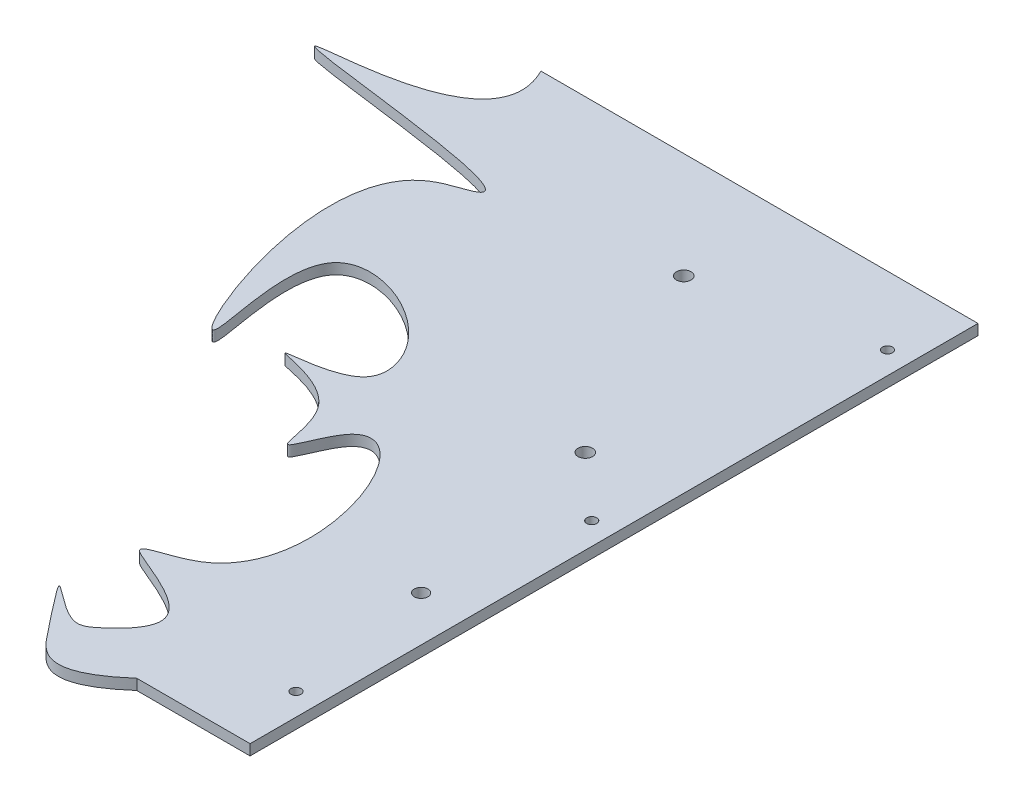
ISO-10303-21;
HEADER;
FILE_DESCRIPTION(('STEP AP214'),'2;1');
FILE_NAME('part.step','',(''),(''),'','','');
FILE_SCHEMA(('AUTOMOTIVE_DESIGN { 1 0 10303 214 1 1 1 1 }'));
ENDSEC;
DATA;
#1=APPLICATION_CONTEXT('core data for automotive mechanical design processes');
#2=APPLICATION_PROTOCOL_DEFINITION('international standard','automotive_design',2000,#1);
#3=PRODUCT_CONTEXT('',#1,'mechanical');
#4=PRODUCT('Part','Part','',(#3));
#5=PRODUCT_RELATED_PRODUCT_CATEGORY('part','',(#4));
#6=PRODUCT_DEFINITION_FORMATION('','',#4);
#7=PRODUCT_DEFINITION_CONTEXT('part definition',#1,'design');
#8=PRODUCT_DEFINITION('design','',#6,#7);
#9=PRODUCT_DEFINITION_SHAPE('','',#8);
#10=(LENGTH_UNIT() NAMED_UNIT(*) SI_UNIT(.MILLI.,.METRE.));
#11=(NAMED_UNIT(*) PLANE_ANGLE_UNIT() SI_UNIT($,.RADIAN.));
#12=(NAMED_UNIT(*) SI_UNIT($,.STERADIAN.) SOLID_ANGLE_UNIT());
#13=UNCERTAINTY_MEASURE_WITH_UNIT(LENGTH_MEASURE(1.E-05),#10,'distance_accuracy_value','');
#14=(GEOMETRIC_REPRESENTATION_CONTEXT(3) GLOBAL_UNCERTAINTY_ASSIGNED_CONTEXT((#13)) GLOBAL_UNIT_ASSIGNED_CONTEXT((#10,
#11,#12)) REPRESENTATION_CONTEXT('',''));
#15=CARTESIAN_POINT('',(0.,0.,0.));
#16=DIRECTION('',(0.,0.,1.));
#17=DIRECTION('',(1.,0.,0.));
#18=AXIS2_PLACEMENT_3D('',#15,#16,#17);
#19=CARTESIAN_POINT('',(0.,2.9718,-203.2));
#20=DIRECTION('',(0.,0.,-1.));
#21=DIRECTION('',(-1.,0.,0.));
#22=AXIS2_PLACEMENT_3D('',#19,#20,#21);
#23=PLANE('',#22);
#24=DIRECTION('',(0.,1.,0.));
#25=VECTOR('',#24,1.);
#26=CARTESIAN_POINT('',(31.6309191849911,0.,-203.2));
#27=LINE('',#26,#25);
#28=CARTESIAN_POINT('',(31.6309191849911,0.,-203.2));
#29=VERTEX_POINT('',#28);
#30=CARTESIAN_POINT('',(31.6309191849911,2.9718,-203.2));
#31=VERTEX_POINT('',#30);
#32=EDGE_CURVE('E139',#29,#31,#27,.T.);
#33=ORIENTED_EDGE('',*,*,#32,.F.);
#34=DIRECTION('',(1.,0.,0.));
#35=VECTOR('',#34,1.);
#36=CARTESIAN_POINT('',(0.,0.,-203.2));
#37=LINE('',#36,#35);
#38=CARTESIAN_POINT('',(-90.3859000000005,0.,-203.2));
#39=VERTEX_POINT('',#38);
#40=EDGE_CURVE('E85',#39,#29,#37,.T.);
#41=ORIENTED_EDGE('',*,*,#40,.F.);
#42=DIRECTION('',(0.,-1.,0.));
#43=VECTOR('',#42,1.);
#44=CARTESIAN_POINT('',(-90.3859000000005,2.9718,-203.2));
#45=LINE('',#44,#43);
#46=CARTESIAN_POINT('',(-90.3859000000005,2.9718,-203.2));
#47=VERTEX_POINT('',#46);
#48=EDGE_CURVE('E11',#47,#39,#45,.T.);
#49=ORIENTED_EDGE('',*,*,#48,.F.);
#50=DIRECTION('',(1.,0.,0.));
#51=VECTOR('',#50,1.);
#52=CARTESIAN_POINT('',(0.,2.9718,-203.2));
#53=LINE('',#52,#51);
#54=EDGE_CURVE('E84',#47,#31,#53,.T.);
#55=ORIENTED_EDGE('',*,*,#54,.T.);
#56=EDGE_LOOP('',(#33,#41,#49,#55));
#57=FACE_BOUND('',#56,.T.);
#58=ADVANCED_FACE('F35',(#57),#23,.T.);
#59=CARTESIAN_POINT('',(0.,2.9718,0.));
#60=DIRECTION('',(0.,0.,-1.));
#61=DIRECTION('',(-1.,0.,0.));
#62=AXIS2_PLACEMENT_3D('',#59,#60,#61);
#63=PLANE('',#62);
#64=DIRECTION('',(1.,0.,0.));
#65=VECTOR('',#64,1.);
#66=CARTESIAN_POINT('',(0.,0.,0.));
#67=LINE('',#66,#65);
#68=CARTESIAN_POINT('',(0.,0.,0.));
#69=VERTEX_POINT('',#68);
#70=CARTESIAN_POINT('',(31.6309191849911,0.,0.));
#71=VERTEX_POINT('',#70);
#72=EDGE_CURVE('E117',#69,#71,#67,.T.);
#73=ORIENTED_EDGE('',*,*,#72,.T.);
#74=DIRECTION('',(0.,1.,0.));
#75=VECTOR('',#74,1.);
#76=CARTESIAN_POINT('',(31.6309191849911,0.,0.));
#77=LINE('',#76,#75);
#78=CARTESIAN_POINT('',(31.6309191849911,2.9718,0.));
#79=VERTEX_POINT('',#78);
#80=EDGE_CURVE('E50',#71,#79,#77,.T.);
#81=ORIENTED_EDGE('',*,*,#80,.T.);
#82=DIRECTION('',(1.,0.,0.));
#83=VECTOR('',#82,1.);
#84=CARTESIAN_POINT('',(0.,2.9718,0.));
#85=LINE('',#84,#83);
#86=CARTESIAN_POINT('',(0.,2.9718,0.));
#87=VERTEX_POINT('',#86);
#88=EDGE_CURVE('E90',#87,#79,#85,.T.);
#89=ORIENTED_EDGE('',*,*,#88,.F.);
#90=DIRECTION('',(0.,-1.,0.));
#91=VECTOR('',#90,1.);
#92=CARTESIAN_POINT('',(0.,2.9718,0.));
#93=LINE('',#92,#91);
#94=EDGE_CURVE('E43',#87,#69,#93,.T.);
#95=ORIENTED_EDGE('',*,*,#94,.T.);
#96=EDGE_LOOP('',(#73,#81,#89,#95));
#97=FACE_BOUND('',#96,.T.);
#98=ADVANCED_FACE('F134',(#97),#63,.F.);
#99=CARTESIAN_POINT('',(25.4,2.9718,-19.05));
#100=DIRECTION('',(0.,-1.,0.));
#101=DIRECTION('',(0.,0.,-1.));
#102=AXIS2_PLACEMENT_3D('',#99,#100,#101);
#103=CYLINDRICAL_SURFACE('',#102,1.397);
#104=CARTESIAN_POINT('',(25.4,2.9718,-19.05));
#105=DIRECTION('',(0.,1.,0.));
#106=DIRECTION('',(0.,0.,1.));
#107=AXIS2_PLACEMENT_3D('',#104,#105,#106);
#108=CIRCLE('',#107,1.397);
#109=CARTESIAN_POINT('',(25.4,2.9718,-17.653));
#110=VERTEX_POINT('',#109);
#111=EDGE_CURVE('E107',#110,#110,#108,.T.);
#112=ORIENTED_EDGE('',*,*,#111,.T.);
#113=EDGE_LOOP('',(#112));
#114=FACE_BOUND('',#113,.T.);
#115=CARTESIAN_POINT('',(25.4,0.,-19.05));
#116=DIRECTION('',(0.,1.,0.));
#117=DIRECTION('',(0.,0.,1.));
#118=AXIS2_PLACEMENT_3D('',#115,#116,#117);
#119=CIRCLE('',#118,1.397);
#120=CARTESIAN_POINT('',(25.4,0.,-17.653));
#121=VERTEX_POINT('',#120);
#122=EDGE_CURVE('E129',#121,#121,#119,.T.);
#123=ORIENTED_EDGE('',*,*,#122,.F.);
#124=EDGE_LOOP('',(#123));
#125=FACE_BOUND('',#124,.T.);
#126=ADVANCED_FACE('F166',(#114,#125),#103,.F.);
#127=CARTESIAN_POINT('',(25.3999999999997,2.9718,-101.6));
#128=DIRECTION('',(0.,-1.,0.));
#129=DIRECTION('',(0.,0.,-1.));
#130=AXIS2_PLACEMENT_3D('',#127,#128,#129);
#131=CYLINDRICAL_SURFACE('',#130,1.397);
#132=CARTESIAN_POINT('',(25.3999999999997,2.9718,-101.6));
#133=DIRECTION('',(0.,1.,0.));
#134=DIRECTION('',(0.,0.,1.));
#135=AXIS2_PLACEMENT_3D('',#132,#133,#134);
#136=CIRCLE('',#135,1.397);
#137=CARTESIAN_POINT('',(25.3999999999997,2.9718,-100.203));
#138=VERTEX_POINT('',#137);
#139=EDGE_CURVE('E104',#138,#138,#136,.T.);
#140=ORIENTED_EDGE('',*,*,#139,.T.);
#141=EDGE_LOOP('',(#140));
#142=FACE_BOUND('',#141,.T.);
#143=CARTESIAN_POINT('',(25.3999999999997,0.,-101.6));
#144=DIRECTION('',(0.,1.,0.));
#145=DIRECTION('',(0.,0.,1.));
#146=AXIS2_PLACEMENT_3D('',#143,#144,#145);
#147=CIRCLE('',#146,1.397);
#148=CARTESIAN_POINT('',(25.3999999999997,0.,-100.203));
#149=VERTEX_POINT('',#148);
#150=EDGE_CURVE('E126',#149,#149,#147,.T.);
#151=ORIENTED_EDGE('',*,*,#150,.F.);
#152=EDGE_LOOP('',(#151));
#153=FACE_BOUND('',#152,.T.);
#154=ADVANCED_FACE('F169',(#142,#153),#131,.F.);
#155=CARTESIAN_POINT('',(25.3999999999994,2.9718,-184.15));
#156=DIRECTION('',(0.,-1.,0.));
#157=DIRECTION('',(0.,0.,-1.));
#158=AXIS2_PLACEMENT_3D('',#155,#156,#157);
#159=CYLINDRICAL_SURFACE('',#158,1.397);
#160=CARTESIAN_POINT('',(25.3999999999994,2.9718,-184.15));
#161=DIRECTION('',(0.,1.,0.));
#162=DIRECTION('',(0.,0.,1.));
#163=AXIS2_PLACEMENT_3D('',#160,#161,#162);
#164=CIRCLE('',#163,1.397);
#165=CARTESIAN_POINT('',(25.3999999999994,2.9718,-182.753));
#166=VERTEX_POINT('',#165);
#167=EDGE_CURVE('E101',#166,#166,#164,.T.);
#168=ORIENTED_EDGE('',*,*,#167,.T.);
#169=EDGE_LOOP('',(#168));
#170=FACE_BOUND('',#169,.T.);
#171=CARTESIAN_POINT('',(25.3999999999994,0.,-184.15));
#172=DIRECTION('',(0.,1.,0.));
#173=DIRECTION('',(0.,0.,1.));
#174=AXIS2_PLACEMENT_3D('',#171,#172,#173);
#175=CIRCLE('',#174,1.397);
#176=CARTESIAN_POINT('',(25.3999999999994,0.,-182.753));
#177=VERTEX_POINT('',#176);
#178=EDGE_CURVE('E123',#177,#177,#175,.T.);
#179=ORIENTED_EDGE('',*,*,#178,.F.);
#180=EDGE_LOOP('',(#179));
#181=FACE_BOUND('',#180,.T.);
#182=ADVANCED_FACE('F173',(#170,#181),#159,.F.);
#183=CARTESIAN_POINT('',(8.00192669314725,2.9718,-117.195820473059));
#184=DIRECTION('',(0.,-1.,0.));
#185=DIRECTION('',(0.,0.,-1.));
#186=AXIS2_PLACEMENT_3D('',#183,#184,#185);
#187=CYLINDRICAL_SURFACE('',#186,2.032);
#188=CARTESIAN_POINT('',(8.00192669314725,2.9718,-117.195820473059));
#189=DIRECTION('',(0.,1.,0.));
#190=DIRECTION('',(0.,0.,1.));
#191=AXIS2_PLACEMENT_3D('',#188,#189,#190);
#192=CIRCLE('',#191,2.032);
#193=CARTESIAN_POINT('',(8.00192669314725,2.9718,-115.163820473059));
#194=VERTEX_POINT('',#193);
#195=EDGE_CURVE('E93',#194,#194,#192,.T.);
#196=ORIENTED_EDGE('',*,*,#195,.T.);
#197=EDGE_LOOP('',(#196));
#198=FACE_BOUND('',#197,.T.);
#199=CARTESIAN_POINT('',(8.00192669314725,0.,-117.195820473059));
#200=DIRECTION('',(0.,1.,0.));
#201=DIRECTION('',(0.,0.,1.));
#202=AXIS2_PLACEMENT_3D('',#199,#200,#201);
#203=CIRCLE('',#202,2.032);
#204=CARTESIAN_POINT('',(8.00192669314725,0.,-115.163820473059));
#205=VERTEX_POINT('',#204);
#206=EDGE_CURVE('E120',#205,#205,#203,.T.);
#207=ORIENTED_EDGE('',*,*,#206,.F.);
#208=EDGE_LOOP('',(#207));
#209=FACE_BOUND('',#208,.T.);
#210=ADVANCED_FACE('F177',(#198,#209),#187,.F.);
#211=CARTESIAN_POINT('',(-20.9228833804103,2.9718,-173.612500152905));
#212=DIRECTION('',(0.,-1.,0.));
#213=DIRECTION('',(0.,0.,-1.));
#214=AXIS2_PLACEMENT_3D('',#211,#212,#213);
#215=CYLINDRICAL_SURFACE('',#214,2.032);
#216=CARTESIAN_POINT('',(-20.9228833804103,2.9718,-173.612500152905));
#217=DIRECTION('',(0.,1.,0.));
#218=DIRECTION('',(0.,0.,1.));
#219=AXIS2_PLACEMENT_3D('',#216,#217,#218);
#220=CIRCLE('',#219,2.032);
#221=CARTESIAN_POINT('',(-20.9228833804103,2.9718,-171.580500152905));
#222=VERTEX_POINT('',#221);
#223=EDGE_CURVE('E91',#222,#222,#220,.T.);
#224=ORIENTED_EDGE('',*,*,#223,.T.);
#225=EDGE_LOOP('',(#224));
#226=FACE_BOUND('',#225,.T.);
#227=CARTESIAN_POINT('',(-20.9228833804103,0.,-173.612500152905));
#228=DIRECTION('',(0.,1.,0.));
#229=DIRECTION('',(0.,0.,1.));
#230=AXIS2_PLACEMENT_3D('',#227,#228,#229);
#231=CIRCLE('',#230,2.032);
#232=CARTESIAN_POINT('',(-20.9228833804103,0.,-171.580500152905));
#233=VERTEX_POINT('',#232);
#234=EDGE_CURVE('E113',#233,#233,#231,.T.);
#235=ORIENTED_EDGE('',*,*,#234,.F.);
#236=EDGE_LOOP('',(#235));
#237=FACE_BOUND('',#236,.T.);
#238=ADVANCED_FACE('F37',(#226,#237),#215,.F.);
#239=CARTESIAN_POINT('',(19.05,2.9718,-60.325));
#240=DIRECTION('',(0.,-1.,0.));
#241=DIRECTION('',(0.,0.,-1.));
#242=AXIS2_PLACEMENT_3D('',#239,#240,#241);
#243=CYLINDRICAL_SURFACE('',#242,1.905);
#244=CARTESIAN_POINT('',(19.05,2.9718,-60.325));
#245=DIRECTION('',(0.,1.,0.));
#246=DIRECTION('',(0.,0.,1.));
#247=AXIS2_PLACEMENT_3D('',#244,#245,#246);
#248=CIRCLE('',#247,1.905);
#249=CARTESIAN_POINT('',(19.05,2.9718,-58.42));
#250=VERTEX_POINT('',#249);
#251=EDGE_CURVE('E110',#250,#250,#248,.T.);
#252=ORIENTED_EDGE('',*,*,#251,.T.);
#253=EDGE_LOOP('',(#252));
#254=FACE_BOUND('',#253,.T.);
#255=CARTESIAN_POINT('',(19.05,0.,-60.325));
#256=DIRECTION('',(0.,1.,0.));
#257=DIRECTION('',(0.,0.,1.));
#258=AXIS2_PLACEMENT_3D('',#255,#256,#257);
#259=CIRCLE('',#258,1.905);
#260=CARTESIAN_POINT('',(19.05,0.,-58.42));
#261=VERTEX_POINT('',#260);
#262=EDGE_CURVE('E96',#261,#261,#259,.T.);
#263=ORIENTED_EDGE('',*,*,#262,.F.);
#264=EDGE_LOOP('',(#263));
#265=FACE_BOUND('',#264,.T.);
#266=ADVANCED_FACE('F160',(#254,#265),#243,.F.);
#267=CARTESIAN_POINT('',(0.,2.9718,0.));
#268=DIRECTION('',(0.,1.,0.));
#269=DIRECTION('',(0.,0.,1.));
#270=AXIS2_PLACEMENT_3D('',#267,#268,#269);
#271=PLANE('',#270);
#272=DIRECTION('',(0.,0.,1.));
#273=VECTOR('',#272,1.);
#274=CARTESIAN_POINT('',(31.6309191849911,2.9718,0.));
#275=LINE('',#274,#273);
#276=EDGE_CURVE('E89',#31,#79,#275,.T.);
#277=ORIENTED_EDGE('',*,*,#276,.F.);
#278=ORIENTED_EDGE('',*,*,#54,.F.);
#279=CARTESIAN_POINT('',(0.,2.9718,0.));
#280=CARTESIAN_POINT('',(-14.4645948878299,2.9718,12.6956898284185));
#281=CARTESIAN_POINT('',(-45.3662352753858,2.9718,-26.0149358825167));
#282=CARTESIAN_POINT('',(-25.2914242086367,2.9718,-1.79030749192196));
#283=CARTESIAN_POINT('',(-15.7443809636019,2.9718,-7.80742889826676));
#284=CARTESIAN_POINT('',(-4.36114916184309,2.9718,-20.2164186583361));
#285=CARTESIAN_POINT('',(-20.9256850402866,2.9718,-26.8984787874602));
#286=CARTESIAN_POINT('',(-34.3906840580299,2.9718,-32.6052104494243));
#287=CARTESIAN_POINT('',(7.67518828404337,2.9718,-37.8722380776448));
#288=CARTESIAN_POINT('',(-23.3746144077905,2.9718,-114.697788395826));
#289=CARTESIAN_POINT('',(-36.7041735862336,2.9718,-69.8936075484726));
#290=CARTESIAN_POINT('',(-36.131542501149,2.9718,-97.5495030693918));
#291=CARTESIAN_POINT('',(-70.641711547488,2.9718,-99.5005560397129));
#292=CARTESIAN_POINT('',(-37.8552966113017,2.9718,-100.496777307158));
#293=CARTESIAN_POINT('',(-40.756498409597,2.9718,-124.838600148654));
#294=CARTESIAN_POINT('',(-85.4307653132301,2.9718,-143.187597424625));
#295=CARTESIAN_POINT('',(-60.9509952661789,2.9718,-57.6519585797915));
#296=CARTESIAN_POINT('',(-103.823887761536,2.9718,-156.563665875977));
#297=CARTESIAN_POINT('',(-47.6308913017507,2.9718,-169.647448316024));
#298=CARTESIAN_POINT('',(-186.570491630882,2.9718,-180.236051464975));
#299=CARTESIAN_POINT('',(-78.0053209619593,2.9718,-178.49195217076));
#300=CARTESIAN_POINT('',(-90.3859000000005,2.9718,-203.2));
#301=B_SPLINE_CURVE_WITH_KNOTS('',3,(#279,#280,#281,#282,#283,#284,#285,#286,#287,#288,#289,
#290,#291,#292,#293,#294,#295,#296,#297,#298,#299,#300),.UNSPECIFIED.,.F.,.F.,(4,1,1,1,1,1,1,1,
1,1,1,1,1,1,1,1,1,1,1,4),(0.,0.00721768259038966,0.0453298415374228,0.0547642616769481,
0.083217198200722,0.130285385821185,0.137597353400816,0.165212972469126,0.280552441046618,
0.307038367357562,0.338456759970852,0.381582262085761,0.421093035047996,0.443121968624883,
0.520121141294352,0.590944265091252,0.735519102059461,0.757642294239479,0.887962505632473,1.),.UNSPECIFIED.);
#302=EDGE_CURVE('E70',#87,#47,#301,.T.);
#303=ORIENTED_EDGE('',*,*,#302,.F.);
#304=ORIENTED_EDGE('',*,*,#88,.T.);
#305=EDGE_LOOP('',(#277,#278,#303,#304));
#306=FACE_BOUND('',#305,.T.);
#307=ORIENTED_EDGE('',*,*,#223,.F.);
#308=EDGE_LOOP('',(#307));
#309=FACE_BOUND('',#308,.T.);
#310=ORIENTED_EDGE('',*,*,#195,.F.);
#311=EDGE_LOOP('',(#310));
#312=FACE_BOUND('',#311,.T.);
#313=ORIENTED_EDGE('',*,*,#167,.F.);
#314=EDGE_LOOP('',(#313));
#315=FACE_BOUND('',#314,.T.);
#316=ORIENTED_EDGE('',*,*,#139,.F.);
#317=EDGE_LOOP('',(#316));
#318=FACE_BOUND('',#317,.T.);
#319=ORIENTED_EDGE('',*,*,#111,.F.);
#320=EDGE_LOOP('',(#319));
#321=FACE_BOUND('',#320,.T.);
#322=ORIENTED_EDGE('',*,*,#251,.F.);
#323=EDGE_LOOP('',(#322));
#324=FACE_BOUND('',#323,.T.);
#325=ADVANCED_FACE('F87',(#306,#309,#312,#315,#318,#321,#324),#271,.T.);
#326=CARTESIAN_POINT('',(0.,0.,0.));
#327=DIRECTION('',(0.,1.,0.));
#328=DIRECTION('',(0.,0.,1.));
#329=AXIS2_PLACEMENT_3D('',#326,#327,#328);
#330=PLANE('',#329);
#331=ORIENTED_EDGE('',*,*,#40,.T.);
#332=DIRECTION('',(0.,0.,1.));
#333=VECTOR('',#332,1.);
#334=CARTESIAN_POINT('',(31.6309191849911,0.,0.));
#335=LINE('',#334,#333);
#336=EDGE_CURVE('E137',#29,#71,#335,.T.);
#337=ORIENTED_EDGE('',*,*,#336,.T.);
#338=ORIENTED_EDGE('',*,*,#72,.F.);
#339=CARTESIAN_POINT('',(0.,0.,0.));
#340=CARTESIAN_POINT('',(-14.4645948878299,0.,12.6956898284185));
#341=CARTESIAN_POINT('',(-45.3662352753858,0.,-26.0149358825167));
#342=CARTESIAN_POINT('',(-25.2914242086367,0.,-1.79030749192196));
#343=CARTESIAN_POINT('',(-15.7443809636019,0.,-7.80742889826676));
#344=CARTESIAN_POINT('',(-4.36114916184309,0.,-20.2164186583361));
#345=CARTESIAN_POINT('',(-20.9256850402866,0.,-26.8984787874602));
#346=CARTESIAN_POINT('',(-34.3906840580299,0.,-32.6052104494243));
#347=CARTESIAN_POINT('',(7.67518828404337,0.,-37.8722380776448));
#348=CARTESIAN_POINT('',(-23.3746144077905,0.,-114.697788395826));
#349=CARTESIAN_POINT('',(-36.7041735862336,0.,-69.8936075484726));
#350=CARTESIAN_POINT('',(-36.131542501149,0.,-97.5495030693918));
#351=CARTESIAN_POINT('',(-70.641711547488,0.,-99.5005560397129));
#352=CARTESIAN_POINT('',(-37.8552966113017,0.,-100.496777307158));
#353=CARTESIAN_POINT('',(-40.756498409597,0.,-124.838600148654));
#354=CARTESIAN_POINT('',(-85.4307653132301,0.,-143.187597424625));
#355=CARTESIAN_POINT('',(-60.9509952661789,0.,-57.6519585797915));
#356=CARTESIAN_POINT('',(-103.823887761536,0.,-156.563665875977));
#357=CARTESIAN_POINT('',(-47.6308913017507,0.,-169.647448316024));
#358=CARTESIAN_POINT('',(-186.570491630882,0.,-180.236051464975));
#359=CARTESIAN_POINT('',(-78.0053209619593,0.,-178.49195217076));
#360=CARTESIAN_POINT('',(-90.3859000000005,0.,-203.2));
#361=B_SPLINE_CURVE_WITH_KNOTS('',3,(#339,#340,#341,#342,#343,#344,#345,#346,#347,#348,#349,
#350,#351,#352,#353,#354,#355,#356,#357,#358,#359,#360),.UNSPECIFIED.,.F.,.F.,(4,1,1,1,1,1,1,1,
1,1,1,1,1,1,1,1,1,1,1,4),(0.,0.00721768259038966,0.0453298415374228,0.0547642616769481,
0.083217198200722,0.130285385821185,0.137597353400816,0.165212972469126,0.280552441046618,
0.307038367357562,0.338456759970852,0.381582262085761,0.421093035047996,0.443121968624883,
0.520121141294352,0.590944265091252,0.735519102059461,0.757642294239479,0.887962505632473,1.),.UNSPECIFIED.);
#362=EDGE_CURVE('E59',#69,#39,#361,.T.);
#363=ORIENTED_EDGE('',*,*,#362,.T.);
#364=EDGE_LOOP('',(#331,#337,#338,#363));
#365=FACE_BOUND('',#364,.T.);
#366=ORIENTED_EDGE('',*,*,#234,.T.);
#367=EDGE_LOOP('',(#366));
#368=FACE_BOUND('',#367,.T.);
#369=ORIENTED_EDGE('',*,*,#206,.T.);
#370=EDGE_LOOP('',(#369));
#371=FACE_BOUND('',#370,.T.);
#372=ORIENTED_EDGE('',*,*,#178,.T.);
#373=EDGE_LOOP('',(#372));
#374=FACE_BOUND('',#373,.T.);
#375=ORIENTED_EDGE('',*,*,#150,.T.);
#376=EDGE_LOOP('',(#375));
#377=FACE_BOUND('',#376,.T.);
#378=ORIENTED_EDGE('',*,*,#122,.T.);
#379=EDGE_LOOP('',(#378));
#380=FACE_BOUND('',#379,.T.);
#381=ORIENTED_EDGE('',*,*,#262,.T.);
#382=EDGE_LOOP('',(#381));
#383=FACE_BOUND('',#382,.T.);
#384=ADVANCED_FACE('F135',(#365,#368,#371,#374,#377,#380,#383),#330,.F.);
#385=DIRECTION('',(0.,1.,0.));
#386=VECTOR('',#385,1.);
#387=SURFACE_OF_LINEAR_EXTRUSION('',#361,#386);
#388=ORIENTED_EDGE('',*,*,#302,.T.);
#389=ORIENTED_EDGE('',*,*,#48,.T.);
#390=ORIENTED_EDGE('',*,*,#362,.F.);
#391=ORIENTED_EDGE('',*,*,#94,.F.);
#392=EDGE_LOOP('',(#388,#389,#390,#391));
#393=FACE_BOUND('',#392,.T.);
#394=ADVANCED_FACE('F72',(#393),#387,.F.);
#395=CARTESIAN_POINT('',(31.6309191849911,0.,0.));
#396=DIRECTION('',(-1.,0.,0.));
#397=DIRECTION('',(0.,0.,1.));
#398=AXIS2_PLACEMENT_3D('',#395,#396,#397);
#399=PLANE('',#398);
#400=ORIENTED_EDGE('',*,*,#276,.T.);
#401=ORIENTED_EDGE('',*,*,#80,.F.);
#402=ORIENTED_EDGE('',*,*,#336,.F.);
#403=ORIENTED_EDGE('',*,*,#32,.T.);
#404=EDGE_LOOP('',(#400,#401,#402,#403));
#405=FACE_BOUND('',#404,.T.);
#406=ADVANCED_FACE('F157',(#405),#399,.F.);
#407=CLOSED_SHELL('',(#58,#98,#126,#154,#182,#210,#238,#266,#325,#384,#394,#406));
#408=MANIFOLD_SOLID_BREP('B2',#407);
#409=ADVANCED_BREP_SHAPE_REPRESENTATION('',(#18,#408),#14);
#410=SHAPE_DEFINITION_REPRESENTATION(#9,#409);
ENDSEC;
END-ISO-10303-21;
